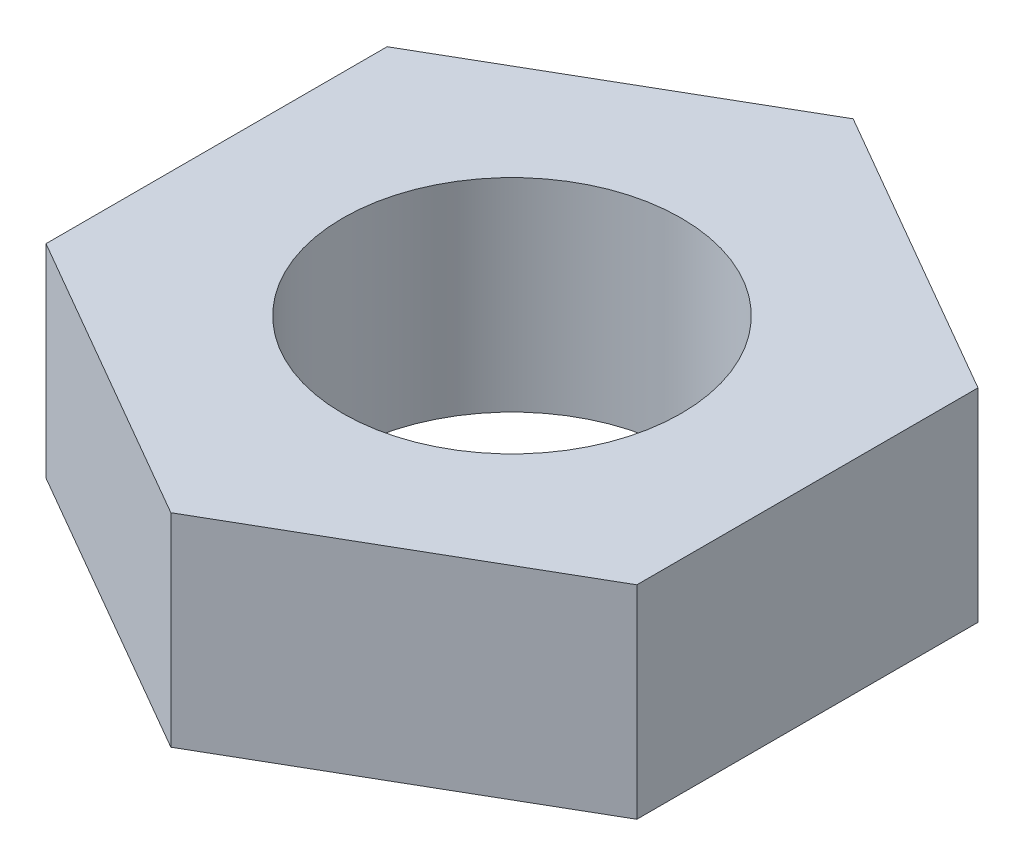
ISO-10303-21;
HEADER;
FILE_DESCRIPTION(('STEP AP214'),'2;1');
FILE_NAME('part.step','',(''),(''),'','','');
FILE_SCHEMA(('AUTOMOTIVE_DESIGN { 1 0 10303 214 1 1 1 1 }'));
ENDSEC;
DATA;
#1=APPLICATION_CONTEXT('core data for automotive mechanical design processes');
#2=APPLICATION_PROTOCOL_DEFINITION('international standard','automotive_design',2000,#1);
#3=PRODUCT_CONTEXT('',#1,'mechanical');
#4=PRODUCT('Part','Part','',(#3));
#5=PRODUCT_RELATED_PRODUCT_CATEGORY('part','',(#4));
#6=PRODUCT_DEFINITION_FORMATION('','',#4);
#7=PRODUCT_DEFINITION_CONTEXT('part definition',#1,'design');
#8=PRODUCT_DEFINITION('design','',#6,#7);
#9=PRODUCT_DEFINITION_SHAPE('','',#8);
#10=(LENGTH_UNIT() NAMED_UNIT(*) SI_UNIT(.MILLI.,.METRE.));
#11=(NAMED_UNIT(*) PLANE_ANGLE_UNIT() SI_UNIT($,.RADIAN.));
#12=(NAMED_UNIT(*) SI_UNIT($,.STERADIAN.) SOLID_ANGLE_UNIT());
#13=UNCERTAINTY_MEASURE_WITH_UNIT(LENGTH_MEASURE(1.E-05),#10,'distance_accuracy_value','');
#14=(GEOMETRIC_REPRESENTATION_CONTEXT(3) GLOBAL_UNCERTAINTY_ASSIGNED_CONTEXT((#13)) GLOBAL_UNIT_ASSIGNED_CONTEXT((#10,
#11,#12)) REPRESENTATION_CONTEXT('',''));
#15=CARTESIAN_POINT('',(0.,0.,0.));
#16=DIRECTION('',(0.,0.,1.));
#17=DIRECTION('',(1.,0.,0.));
#18=AXIS2_PLACEMENT_3D('',#15,#16,#17);
#19=CARTESIAN_POINT('',(0.,9.525,0.));
#20=DIRECTION('',(0.,1.,0.));
#21=DIRECTION('',(0.,0.,1.));
#22=AXIS2_PLACEMENT_3D('',#19,#20,#21);
#23=PLANE('',#22);
#24=DIRECTION('',(-0.866025403784439,0.,-0.5));
#25=VECTOR('',#24,1.);
#26=CARTESIAN_POINT('',(13.856406460551,9.525,-8.00000000000001));
#27=LINE('',#26,#25);
#28=CARTESIAN_POINT('',(13.856406460551,9.525,-8.00000000000001));
#29=VERTEX_POINT('',#28);
#30=CARTESIAN_POINT('',(0.,9.525,-16.));
#31=VERTEX_POINT('',#30);
#32=EDGE_CURVE('E128',#29,#31,#27,.T.);
#33=ORIENTED_EDGE('',*,*,#32,.T.);
#34=DIRECTION('',(-0.866025403784438,0.,0.5));
#35=VECTOR('',#34,1.);
#36=CARTESIAN_POINT('',(0.,9.525,-16.));
#37=LINE('',#36,#35);
#38=CARTESIAN_POINT('',(-13.856406460551,9.525,-7.99999999999999));
#39=VERTEX_POINT('',#38);
#40=EDGE_CURVE('E86',#31,#39,#37,.T.);
#41=ORIENTED_EDGE('',*,*,#40,.T.);
#42=DIRECTION('',(0.,0.,1.));
#43=VECTOR('',#42,1.);
#44=CARTESIAN_POINT('',(-13.856406460551,9.525,-7.99999999999999));
#45=LINE('',#44,#43);
#46=CARTESIAN_POINT('',(-13.856406460551,9.525,8.));
#47=VERTEX_POINT('',#46);
#48=EDGE_CURVE('E99',#39,#47,#45,.T.);
#49=ORIENTED_EDGE('',*,*,#48,.T.);
#50=DIRECTION('',(0.866025403784439,0.,0.5));
#51=VECTOR('',#50,1.);
#52=CARTESIAN_POINT('',(-13.856406460551,9.525,8.));
#53=LINE('',#52,#51);
#54=CARTESIAN_POINT('',(0.,9.525,16.));
#55=VERTEX_POINT('',#54);
#56=EDGE_CURVE('E93',#47,#55,#53,.T.);
#57=ORIENTED_EDGE('',*,*,#56,.T.);
#58=DIRECTION('',(0.866025403784439,0.,-0.5));
#59=VECTOR('',#58,1.);
#60=CARTESIAN_POINT('',(0.,9.525,16.));
#61=LINE('',#60,#59);
#62=CARTESIAN_POINT('',(13.856406460551,9.525,8.));
#63=VERTEX_POINT('',#62);
#64=EDGE_CURVE('E97',#55,#63,#61,.T.);
#65=ORIENTED_EDGE('',*,*,#64,.T.);
#66=DIRECTION('',(0.,0.,-1.));
#67=VECTOR('',#66,1.);
#68=CARTESIAN_POINT('',(13.856406460551,9.525,8.));
#69=LINE('',#68,#67);
#70=EDGE_CURVE('E49',#63,#29,#69,.T.);
#71=ORIENTED_EDGE('',*,*,#70,.T.);
#72=EDGE_LOOP('',(#33,#41,#49,#57,#65,#71));
#73=FACE_BOUND('',#72,.T.);
#74=CARTESIAN_POINT('',(0.,9.525,0.));
#75=DIRECTION('',(0.,1.,0.));
#76=DIRECTION('',(0.,0.,1.));
#77=AXIS2_PLACEMENT_3D('',#74,#75,#76);
#78=CIRCLE('',#77,7.9375);
#79=CARTESIAN_POINT('',(0.,9.525,-7.9375));
#80=VERTEX_POINT('',#79);
#81=EDGE_CURVE('E121',#80,#80,#78,.T.);
#82=ORIENTED_EDGE('',*,*,#81,.F.);
#83=EDGE_LOOP('',(#82));
#84=FACE_BOUND('',#83,.T.);
#85=ADVANCED_FACE('F32',(#73,#84),#23,.T.);
#86=CARTESIAN_POINT('',(0.,0.,0.));
#87=DIRECTION('',(0.,1.,0.));
#88=DIRECTION('',(0.,0.,1.));
#89=AXIS2_PLACEMENT_3D('',#86,#87,#88);
#90=PLANE('',#89);
#91=DIRECTION('',(-0.866025403784439,0.,-0.5));
#92=VECTOR('',#91,1.);
#93=CARTESIAN_POINT('',(13.856406460551,0.,-8.00000000000001));
#94=LINE('',#93,#92);
#95=CARTESIAN_POINT('',(13.856406460551,0.,-8.00000000000001));
#96=VERTEX_POINT('',#95);
#97=CARTESIAN_POINT('',(0.,0.,-16.));
#98=VERTEX_POINT('',#97);
#99=EDGE_CURVE('E117',#96,#98,#94,.T.);
#100=ORIENTED_EDGE('',*,*,#99,.F.);
#101=DIRECTION('',(0.,0.,-1.));
#102=VECTOR('',#101,1.);
#103=CARTESIAN_POINT('',(13.856406460551,0.,8.));
#104=LINE('',#103,#102);
#105=CARTESIAN_POINT('',(13.856406460551,0.,8.));
#106=VERTEX_POINT('',#105);
#107=EDGE_CURVE('E78',#106,#96,#104,.T.);
#108=ORIENTED_EDGE('',*,*,#107,.F.);
#109=DIRECTION('',(0.866025403784439,0.,-0.5));
#110=VECTOR('',#109,1.);
#111=CARTESIAN_POINT('',(0.,0.,16.));
#112=LINE('',#111,#110);
#113=CARTESIAN_POINT('',(0.,0.,16.));
#114=VERTEX_POINT('',#113);
#115=EDGE_CURVE('E72',#114,#106,#112,.T.);
#116=ORIENTED_EDGE('',*,*,#115,.F.);
#117=DIRECTION('',(0.866025403784439,0.,0.5));
#118=VECTOR('',#117,1.);
#119=CARTESIAN_POINT('',(-13.856406460551,0.,8.));
#120=LINE('',#119,#118);
#121=CARTESIAN_POINT('',(-13.856406460551,0.,8.));
#122=VERTEX_POINT('',#121);
#123=EDGE_CURVE('E107',#122,#114,#120,.T.);
#124=ORIENTED_EDGE('',*,*,#123,.F.);
#125=DIRECTION('',(0.,0.,1.));
#126=VECTOR('',#125,1.);
#127=CARTESIAN_POINT('',(-13.856406460551,0.,-7.99999999999999));
#128=LINE('',#127,#126);
#129=CARTESIAN_POINT('',(-13.856406460551,0.,-7.99999999999999));
#130=VERTEX_POINT('',#129);
#131=EDGE_CURVE('E123',#130,#122,#128,.T.);
#132=ORIENTED_EDGE('',*,*,#131,.F.);
#133=DIRECTION('',(-0.866025403784438,0.,0.5));
#134=VECTOR('',#133,1.);
#135=CARTESIAN_POINT('',(0.,0.,-16.));
#136=LINE('',#135,#134);
#137=EDGE_CURVE('E120',#98,#130,#136,.T.);
#138=ORIENTED_EDGE('',*,*,#137,.F.);
#139=EDGE_LOOP('',(#100,#108,#116,#124,#132,#138));
#140=FACE_BOUND('',#139,.T.);
#141=CARTESIAN_POINT('',(0.,0.,0.));
#142=DIRECTION('',(0.,1.,0.));
#143=DIRECTION('',(0.,0.,1.));
#144=AXIS2_PLACEMENT_3D('',#141,#142,#143);
#145=CIRCLE('',#144,7.9375);
#146=CARTESIAN_POINT('',(0.,0.,-7.9375));
#147=VERTEX_POINT('',#146);
#148=EDGE_CURVE('E221',#147,#147,#145,.T.);
#149=ORIENTED_EDGE('',*,*,#148,.T.);
#150=EDGE_LOOP('',(#149));
#151=FACE_BOUND('',#150,.T.);
#152=ADVANCED_FACE('F137',(#140,#151),#90,.F.);
#153=CARTESIAN_POINT('',(13.856406460551,9.525,-8.00000000000001));
#154=DIRECTION('',(-0.5,0.,0.866025403784439));
#155=DIRECTION('',(0.866025403784439,0.,0.5));
#156=AXIS2_PLACEMENT_3D('',#153,#154,#155);
#157=PLANE('',#156);
#158=ORIENTED_EDGE('',*,*,#99,.T.);
#159=DIRECTION('',(0.,-1.,0.));
#160=VECTOR('',#159,1.);
#161=CARTESIAN_POINT('',(0.,9.525,-16.));
#162=LINE('',#161,#160);
#163=EDGE_CURVE('E11',#31,#98,#162,.T.);
#164=ORIENTED_EDGE('',*,*,#163,.F.);
#165=ORIENTED_EDGE('',*,*,#32,.F.);
#166=DIRECTION('',(0.,-1.,0.));
#167=VECTOR('',#166,1.);
#168=CARTESIAN_POINT('',(13.856406460551,9.525,-8.00000000000001));
#169=LINE('',#168,#167);
#170=EDGE_CURVE('E113',#29,#96,#169,.T.);
#171=ORIENTED_EDGE('',*,*,#170,.T.);
#172=EDGE_LOOP('',(#158,#164,#165,#171));
#173=FACE_BOUND('',#172,.T.);
#174=ADVANCED_FACE('F34',(#173),#157,.F.);
#175=CARTESIAN_POINT('',(0.,9.525,-16.));
#176=DIRECTION('',(0.5,0.,0.866025403784438));
#177=DIRECTION('',(0.866025403784438,0.,-0.5));
#178=AXIS2_PLACEMENT_3D('',#175,#176,#177);
#179=PLANE('',#178);
#180=ORIENTED_EDGE('',*,*,#137,.T.);
#181=DIRECTION('',(0.,-1.,0.));
#182=VECTOR('',#181,1.);
#183=CARTESIAN_POINT('',(-13.856406460551,9.525,-7.99999999999999));
#184=LINE('',#183,#182);
#185=EDGE_CURVE('E41',#39,#130,#184,.T.);
#186=ORIENTED_EDGE('',*,*,#185,.F.);
#187=ORIENTED_EDGE('',*,*,#40,.F.);
#188=ORIENTED_EDGE('',*,*,#163,.T.);
#189=EDGE_LOOP('',(#180,#186,#187,#188));
#190=FACE_BOUND('',#189,.T.);
#191=ADVANCED_FACE('F162',(#190),#179,.F.);
#192=CARTESIAN_POINT('',(-13.856406460551,9.525,-7.99999999999999));
#193=DIRECTION('',(1.,0.,0.));
#194=DIRECTION('',(0.,0.,-1.));
#195=AXIS2_PLACEMENT_3D('',#192,#193,#194);
#196=PLANE('',#195);
#197=ORIENTED_EDGE('',*,*,#131,.T.);
#198=DIRECTION('',(0.,-1.,0.));
#199=VECTOR('',#198,1.);
#200=CARTESIAN_POINT('',(-13.856406460551,9.525,8.));
#201=LINE('',#200,#199);
#202=EDGE_CURVE('E108',#47,#122,#201,.T.);
#203=ORIENTED_EDGE('',*,*,#202,.F.);
#204=ORIENTED_EDGE('',*,*,#48,.F.);
#205=ORIENTED_EDGE('',*,*,#185,.T.);
#206=EDGE_LOOP('',(#197,#203,#204,#205));
#207=FACE_BOUND('',#206,.T.);
#208=ADVANCED_FACE('F134',(#207),#196,.F.);
#209=CARTESIAN_POINT('',(-13.856406460551,9.525,8.));
#210=DIRECTION('',(0.5,0.,-0.866025403784439));
#211=DIRECTION('',(-0.866025403784439,0.,-0.5));
#212=AXIS2_PLACEMENT_3D('',#209,#210,#211);
#213=PLANE('',#212);
#214=ORIENTED_EDGE('',*,*,#123,.T.);
#215=DIRECTION('',(0.,-1.,0.));
#216=VECTOR('',#215,1.);
#217=CARTESIAN_POINT('',(0.,9.525,16.));
#218=LINE('',#217,#216);
#219=EDGE_CURVE('E104',#55,#114,#218,.T.);
#220=ORIENTED_EDGE('',*,*,#219,.F.);
#221=ORIENTED_EDGE('',*,*,#56,.F.);
#222=ORIENTED_EDGE('',*,*,#202,.T.);
#223=EDGE_LOOP('',(#214,#220,#221,#222));
#224=FACE_BOUND('',#223,.T.);
#225=ADVANCED_FACE('F105',(#224),#213,.F.);
#226=CARTESIAN_POINT('',(0.,9.525,16.));
#227=DIRECTION('',(-0.5,0.,-0.866025403784439));
#228=DIRECTION('',(-0.866025403784439,0.,0.5));
#229=AXIS2_PLACEMENT_3D('',#226,#227,#228);
#230=PLANE('',#229);
#231=ORIENTED_EDGE('',*,*,#115,.T.);
#232=DIRECTION('',(0.,-1.,0.));
#233=VECTOR('',#232,1.);
#234=CARTESIAN_POINT('',(13.856406460551,9.525,8.));
#235=LINE('',#234,#233);
#236=EDGE_CURVE('E109',#63,#106,#235,.T.);
#237=ORIENTED_EDGE('',*,*,#236,.F.);
#238=ORIENTED_EDGE('',*,*,#64,.F.);
#239=ORIENTED_EDGE('',*,*,#219,.T.);
#240=EDGE_LOOP('',(#231,#237,#238,#239));
#241=FACE_BOUND('',#240,.T.);
#242=ADVANCED_FACE('F111',(#241),#230,.F.);
#243=CARTESIAN_POINT('',(13.856406460551,9.525,8.));
#244=DIRECTION('',(-1.,0.,0.));
#245=DIRECTION('',(0.,0.,1.));
#246=AXIS2_PLACEMENT_3D('',#243,#244,#245);
#247=PLANE('',#246);
#248=ORIENTED_EDGE('',*,*,#107,.T.);
#249=ORIENTED_EDGE('',*,*,#170,.F.);
#250=ORIENTED_EDGE('',*,*,#70,.F.);
#251=ORIENTED_EDGE('',*,*,#236,.T.);
#252=EDGE_LOOP('',(#248,#249,#250,#251));
#253=FACE_BOUND('',#252,.T.);
#254=ADVANCED_FACE('F142',(#253),#247,.F.);
#255=CARTESIAN_POINT('',(0.,9.525,0.));
#256=DIRECTION('',(0.,-1.,0.));
#257=DIRECTION('',(0.,0.,-1.));
#258=AXIS2_PLACEMENT_3D('',#255,#256,#257);
#259=CYLINDRICAL_SURFACE('',#258,7.9375);
#260=CARTESIAN_POINT('',(0.,9.525,-7.9375));
#261=CARTESIAN_POINT('',(0.,9.42578125,-7.9375));
#262=CARTESIAN_POINT('',(0.,9.3265625,-7.9375));
#263=CARTESIAN_POINT('',(0.,9.128125,-7.9375));
#264=CARTESIAN_POINT('',(0.,9.02890625,-7.9375));
#265=CARTESIAN_POINT('',(0.,8.83046875,-7.9375));
#266=CARTESIAN_POINT('',(0.,8.73125,-7.9375));
#267=CARTESIAN_POINT('',(0.,8.5328125,-7.9375));
#268=CARTESIAN_POINT('',(0.,8.43359375,-7.9375));
#269=CARTESIAN_POINT('',(0.,8.23515625,-7.9375));
#270=CARTESIAN_POINT('',(0.,8.1359375,-7.9375));
#271=CARTESIAN_POINT('',(0.,7.9375,-7.9375));
#272=CARTESIAN_POINT('',(0.,7.83828125,-7.9375));
#273=CARTESIAN_POINT('',(0.,7.63984375,-7.9375));
#274=CARTESIAN_POINT('',(0.,7.540625,-7.9375));
#275=CARTESIAN_POINT('',(0.,7.3421875,-7.9375));
#276=CARTESIAN_POINT('',(0.,7.24296875,-7.9375));
#277=CARTESIAN_POINT('',(0.,7.04453125,-7.9375));
#278=CARTESIAN_POINT('',(0.,6.9453125,-7.9375));
#279=CARTESIAN_POINT('',(0.,6.746875,-7.9375));
#280=CARTESIAN_POINT('',(0.,6.64765625,-7.9375));
#281=CARTESIAN_POINT('',(0.,6.44921875,-7.9375));
#282=CARTESIAN_POINT('',(0.,6.35,-7.9375));
#283=CARTESIAN_POINT('',(0.,6.1515625,-7.9375));
#284=CARTESIAN_POINT('',(0.,6.05234375,-7.9375));
#285=CARTESIAN_POINT('',(0.,5.85390625,-7.9375));
#286=CARTESIAN_POINT('',(0.,5.7546875,-7.9375));
#287=CARTESIAN_POINT('',(0.,5.55625,-7.9375));
#288=CARTESIAN_POINT('',(0.,5.45703125,-7.9375));
#289=CARTESIAN_POINT('',(0.,5.25859375,-7.9375));
#290=CARTESIAN_POINT('',(0.,5.159375,-7.9375));
#291=CARTESIAN_POINT('',(0.,4.9609375,-7.9375));
#292=CARTESIAN_POINT('',(0.,4.86171875,-7.9375));
#293=CARTESIAN_POINT('',(0.,4.66328125,-7.9375));
#294=CARTESIAN_POINT('',(0.,4.5640625,-7.9375));
#295=CARTESIAN_POINT('',(0.,4.365625,-7.9375));
#296=CARTESIAN_POINT('',(0.,4.26640625,-7.9375));
#297=CARTESIAN_POINT('',(0.,4.06796875,-7.9375));
#298=CARTESIAN_POINT('',(0.,3.96875,-7.9375));
#299=CARTESIAN_POINT('',(0.,3.7703125,-7.9375));
#300=CARTESIAN_POINT('',(0.,3.67109375,-7.9375));
#301=CARTESIAN_POINT('',(0.,3.47265625,-7.9375));
#302=CARTESIAN_POINT('',(0.,3.3734375,-7.9375));
#303=CARTESIAN_POINT('',(0.,3.175,-7.9375));
#304=CARTESIAN_POINT('',(0.,3.07578125,-7.9375));
#305=CARTESIAN_POINT('',(0.,2.87734375,-7.9375));
#306=CARTESIAN_POINT('',(0.,2.778125,-7.9375));
#307=CARTESIAN_POINT('',(0.,2.5796875,-7.9375));
#308=CARTESIAN_POINT('',(0.,2.48046875,-7.9375));
#309=CARTESIAN_POINT('',(0.,2.28203125,-7.9375));
#310=CARTESIAN_POINT('',(0.,2.1828125,-7.9375));
#311=CARTESIAN_POINT('',(0.,1.984375,-7.9375));
#312=CARTESIAN_POINT('',(0.,1.88515625,-7.9375));
#313=CARTESIAN_POINT('',(0.,1.68671875,-7.9375));
#314=CARTESIAN_POINT('',(0.,1.5875,-7.9375));
#315=CARTESIAN_POINT('',(0.,1.3890625,-7.9375));
#316=CARTESIAN_POINT('',(0.,1.28984375,-7.9375));
#317=CARTESIAN_POINT('',(0.,1.09140625,-7.9375));
#318=CARTESIAN_POINT('',(0.,0.992187500000001,-7.9375));
#319=CARTESIAN_POINT('',(0.,0.793750000000001,-7.9375));
#320=CARTESIAN_POINT('',(0.,0.69453125,-7.9375));
#321=CARTESIAN_POINT('',(0.,0.49609375,-7.9375));
#322=CARTESIAN_POINT('',(0.,0.396875,-7.9375));
#323=CARTESIAN_POINT('',(0.,0.1984375,-7.9375));
#324=CARTESIAN_POINT('',(0.,0.0992187500000001,-7.9375));
#325=CARTESIAN_POINT('',(0.,0.,-7.9375));
#326=B_SPLINE_CURVE_WITH_KNOTS('',3,(#260,#261,#262,#263,#264,#265,#266,#267,#268,#269,#270,
#271,#272,#273,#274,#275,#276,#277,#278,#279,#280,#281,#282,#283,#284,#285,#286,#287,#288,#289,
#290,#291,#292,#293,#294,#295,#296,#297,#298,#299,#300,#301,#302,#303,#304,#305,#306,#307,#308,
#309,#310,#311,#312,#313,#314,#315,#316,#317,#318,#319,#320,#321,#322,#323,#324,#325),
.UNSPECIFIED.,.F.,.F.,(4,2,2,2,2,2,2,2,2,2,2,2,2,2,2,2,2,2,2,2,2,2,2,2,2,2,2,2,2,2,2,2,4),(0.,
0.297656249999998,0.595312499999999,0.892968749999999,1.190625,1.48828125,1.7859375,2.08359375,
2.38125,2.67890625,2.9765625,3.27421875,3.571875,3.86953125,4.1671875,4.46484375,4.7625,
5.06015625,5.3578125,5.65546875,5.953125,6.25078125,6.5484375,6.84609375,7.14375,7.44140625,
7.7390625,8.03671875,8.334375,8.63203125,8.9296875,9.22734375,9.525),.UNSPECIFIED.);
#327=EDGE_CURVE('BSEAM144',#80,#147,#326,.T.);
#328=ORIENTED_EDGE('',*,*,#81,.T.);
#329=ORIENTED_EDGE('',*,*,#148,.F.);
#330=ORIENTED_EDGE('',*,*,#327,.T.);
#331=ORIENTED_EDGE('',*,*,#327,.F.);
#332=EDGE_LOOP('',(#328,#330,#329,#331));
#333=FACE_BOUND('',#332,.T.);
#334=ADVANCED_FACE('F144',(#333),#259,.F.);
#335=CLOSED_SHELL('',(#85,#152,#174,#191,#208,#225,#242,#254,#334));
#336=MANIFOLD_SOLID_BREP('B2',#335);
#337=ADVANCED_BREP_SHAPE_REPRESENTATION('',(#18,#336),#14);
#338=SHAPE_DEFINITION_REPRESENTATION(#9,#337);
ENDSEC;
END-ISO-10303-21;
